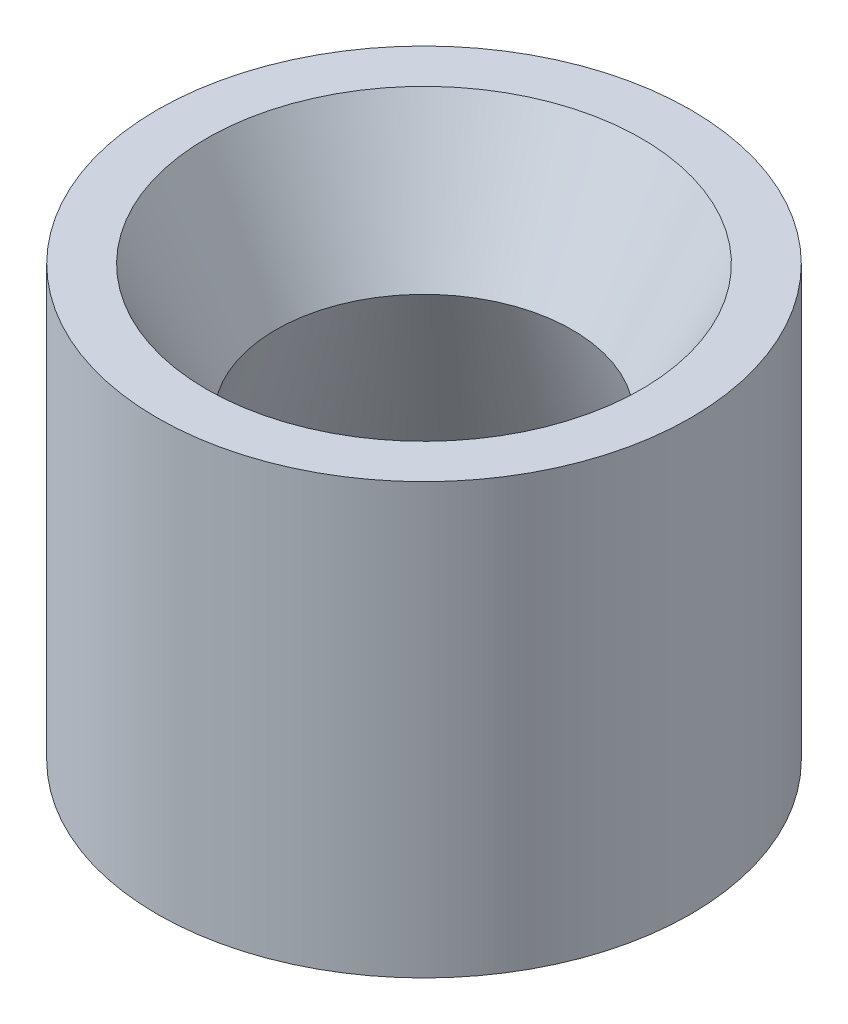
ISO-10303-21;
HEADER;
FILE_DESCRIPTION(('STEP AP214'),'2;1');
FILE_NAME('part.step','',(''),(''),'','','');
FILE_SCHEMA(('AUTOMOTIVE_DESIGN { 1 0 10303 214 1 1 1 1 }'));
ENDSEC;
DATA;
#1=APPLICATION_CONTEXT('core data for automotive mechanical design processes');
#2=APPLICATION_PROTOCOL_DEFINITION('international standard','automotive_design',2000,#1);
#3=PRODUCT_CONTEXT('',#1,'mechanical');
#4=PRODUCT('Part','Part','',(#3));
#5=PRODUCT_RELATED_PRODUCT_CATEGORY('part','',(#4));
#6=PRODUCT_DEFINITION_FORMATION('','',#4);
#7=PRODUCT_DEFINITION_CONTEXT('part definition',#1,'design');
#8=PRODUCT_DEFINITION('design','',#6,#7);
#9=PRODUCT_DEFINITION_SHAPE('','',#8);
#10=(LENGTH_UNIT() NAMED_UNIT(*) SI_UNIT(.MILLI.,.METRE.));
#11=(NAMED_UNIT(*) PLANE_ANGLE_UNIT() SI_UNIT($,.RADIAN.));
#12=(NAMED_UNIT(*) SI_UNIT($,.STERADIAN.) SOLID_ANGLE_UNIT());
#13=UNCERTAINTY_MEASURE_WITH_UNIT(LENGTH_MEASURE(1.E-05),#10,'distance_accuracy_value','');
#14=(GEOMETRIC_REPRESENTATION_CONTEXT(3) GLOBAL_UNCERTAINTY_ASSIGNED_CONTEXT((#13)) GLOBAL_UNIT_ASSIGNED_CONTEXT((#10,
#11,#12)) REPRESENTATION_CONTEXT('',''));
#15=CARTESIAN_POINT('',(0.,0.,0.));
#16=DIRECTION('',(0.,0.,1.));
#17=DIRECTION('',(1.,0.,0.));
#18=AXIS2_PLACEMENT_3D('',#15,#16,#17);
#19=CARTESIAN_POINT('',(0.,-16.8627404502182,0.));
#20=DIRECTION('',(0.,1.,0.));
#21=DIRECTION('',(0.,0.,1.));
#22=AXIS2_PLACEMENT_3D('',#19,#20,#21);
#23=CONICAL_SURFACE('',#22,19.05,0.485168378411989);
#24=CARTESIAN_POINT('',(0.,0.,0.));
#25=DIRECTION('',(0.,1.,0.));
#26=DIRECTION('',(0.,0.,1.));
#27=AXIS2_PLACEMENT_3D('',#24,#25,#26);
#28=CIRCLE('',#27,27.94);
#29=CARTESIAN_POINT('',(0.,0.,27.94));
#30=VERTEX_POINT('',#29);
#31=EDGE_CURVE('E10',#30,#30,#28,.T.);
#32=ORIENTED_EDGE('',*,*,#31,.T.);
#33=EDGE_LOOP('',(#32));
#34=FACE_BOUND('',#33,.T.);
#35=CARTESIAN_POINT('',(0.,-16.8627404502182,0.));
#36=DIRECTION('',(0.,1.,0.));
#37=DIRECTION('',(0.,0.,1.));
#38=AXIS2_PLACEMENT_3D('',#35,#36,#37);
#39=CIRCLE('',#38,19.05);
#40=CARTESIAN_POINT('',(0.,-16.8627404502182,19.05));
#41=VERTEX_POINT('',#40);
#42=EDGE_CURVE('E60',#41,#41,#39,.T.);
#43=ORIENTED_EDGE('',*,*,#42,.F.);
#44=EDGE_LOOP('',(#43));
#45=FACE_BOUND('',#44,.T.);
#46=ADVANCED_FACE('F36',(#34,#45),#23,.F.);
#47=CARTESIAN_POINT('',(-27.94,0.,0.));
#48=DIRECTION('',(0.,1.,0.));
#49=DIRECTION('',(0.,0.,1.));
#50=AXIS2_PLACEMENT_3D('',#47,#48,#49);
#51=PLANE('',#50);
#52=CARTESIAN_POINT('',(0.,0.,0.));
#53=DIRECTION('',(0.,1.,0.));
#54=DIRECTION('',(0.,0.,1.));
#55=AXIS2_PLACEMENT_3D('',#52,#53,#54);
#56=CIRCLE('',#55,34.29);
#57=CARTESIAN_POINT('',(0.,0.,34.29));
#58=VERTEX_POINT('',#57);
#59=EDGE_CURVE('E43',#58,#58,#56,.T.);
#60=ORIENTED_EDGE('',*,*,#59,.T.);
#61=EDGE_LOOP('',(#60));
#62=FACE_BOUND('',#61,.T.);
#63=ORIENTED_EDGE('',*,*,#31,.F.);
#64=EDGE_LOOP('',(#63));
#65=FACE_BOUND('',#64,.T.);
#66=ADVANCED_FACE('F68',(#62,#65),#51,.T.);
#67=CARTESIAN_POINT('',(0.,0.,0.));
#68=DIRECTION('',(0.,1.,0.));
#69=DIRECTION('',(0.,0.,1.));
#70=AXIS2_PLACEMENT_3D('',#67,#68,#69);
#71=CYLINDRICAL_SURFACE('',#70,34.29);
#72=CARTESIAN_POINT('',(0.,-55.245,0.));
#73=DIRECTION('',(0.,1.,0.));
#74=DIRECTION('',(0.,0.,1.));
#75=AXIS2_PLACEMENT_3D('',#72,#73,#74);
#76=CIRCLE('',#75,34.29);
#77=CARTESIAN_POINT('',(0.,-55.245,34.29));
#78=VERTEX_POINT('',#77);
#79=EDGE_CURVE('E49',#78,#78,#76,.T.);
#80=ORIENTED_EDGE('',*,*,#79,.T.);
#81=EDGE_LOOP('',(#80));
#82=FACE_BOUND('',#81,.T.);
#83=ORIENTED_EDGE('',*,*,#59,.F.);
#84=EDGE_LOOP('',(#83));
#85=FACE_BOUND('',#84,.T.);
#86=ADVANCED_FACE('F72',(#82,#85),#71,.T.);
#87=CARTESIAN_POINT('',(-34.29,-55.245,0.));
#88=DIRECTION('',(0.,-1.,0.));
#89=DIRECTION('',(0.,0.,-1.));
#90=AXIS2_PLACEMENT_3D('',#87,#88,#89);
#91=PLANE('',#90);
#92=CARTESIAN_POINT('',(0.,-55.245,0.));
#93=DIRECTION('',(0.,1.,0.));
#94=DIRECTION('',(0.,0.,1.));
#95=AXIS2_PLACEMENT_3D('',#92,#93,#94);
#96=CIRCLE('',#95,33.02);
#97=CARTESIAN_POINT('',(0.,-55.245,33.02));
#98=VERTEX_POINT('',#97);
#99=EDGE_CURVE('E54',#98,#98,#96,.T.);
#100=ORIENTED_EDGE('',*,*,#99,.T.);
#101=EDGE_LOOP('',(#100));
#102=FACE_BOUND('',#101,.T.);
#103=ORIENTED_EDGE('',*,*,#79,.F.);
#104=EDGE_LOOP('',(#103));
#105=FACE_BOUND('',#104,.T.);
#106=ADVANCED_FACE('F76',(#102,#105),#91,.T.);
#107=CARTESIAN_POINT('',(0.,-55.245,0.));
#108=DIRECTION('',(0.,-1.,0.));
#109=DIRECTION('',(0.,0.,-1.));
#110=AXIS2_PLACEMENT_3D('',#107,#108,#109);
#111=CONICAL_SURFACE('',#110,33.02,0.34906585039886);
#112=ORIENTED_EDGE('',*,*,#42,.T.);
#113=EDGE_LOOP('',(#112));
#114=FACE_BOUND('',#113,.T.);
#115=ORIENTED_EDGE('',*,*,#99,.F.);
#116=EDGE_LOOP('',(#115));
#117=FACE_BOUND('',#116,.T.);
#118=ADVANCED_FACE('F64',(#114,#117),#111,.F.);
#119=CLOSED_SHELL('',(#46,#66,#86,#106,#118));
#120=MANIFOLD_SOLID_BREP('B2',#119);
#121=ADVANCED_BREP_SHAPE_REPRESENTATION('',(#18,#120),#14);
#122=SHAPE_DEFINITION_REPRESENTATION(#9,#121);
ENDSEC;
END-ISO-10303-21;
